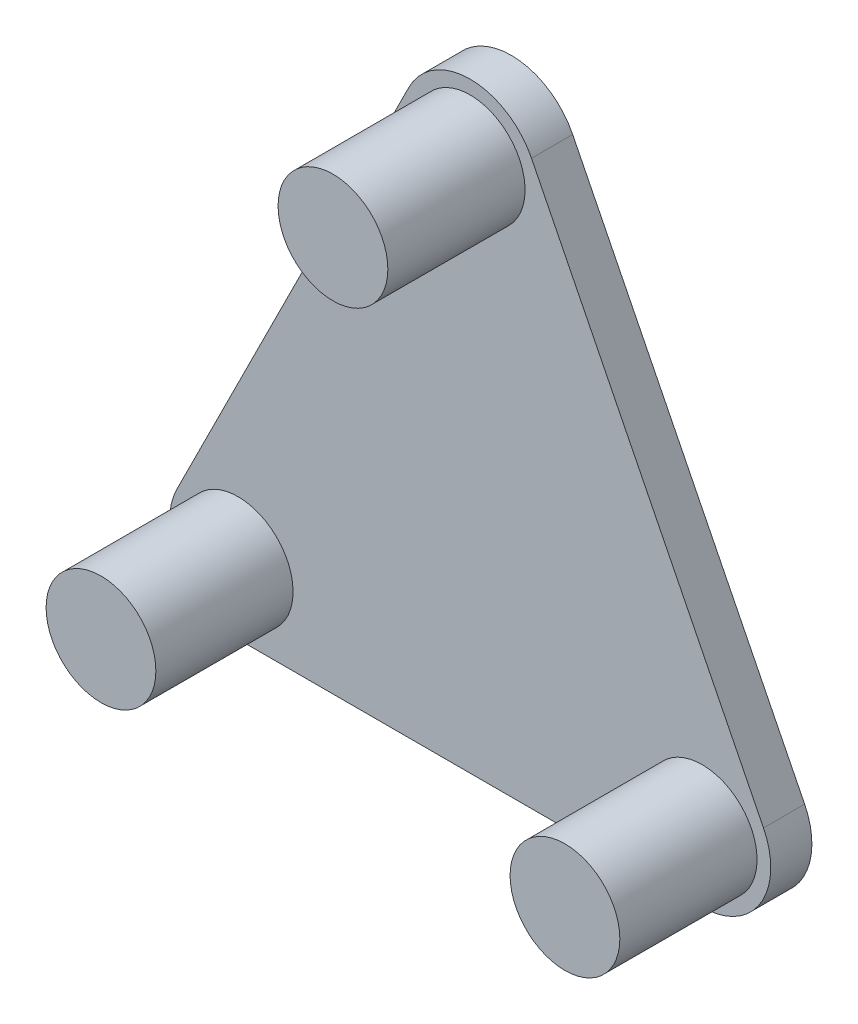
ISO-10303-21;
HEADER;
FILE_DESCRIPTION(('STEP AP214'),'2;1');
FILE_NAME('part.step','',(''),(''),'','','');
FILE_SCHEMA(('AUTOMOTIVE_DESIGN { 1 0 10303 214 1 1 1 1 }'));
ENDSEC;
DATA;
#1=APPLICATION_CONTEXT('core data for automotive mechanical design processes');
#2=APPLICATION_PROTOCOL_DEFINITION('international standard','automotive_design',2000,#1);
#3=PRODUCT_CONTEXT('',#1,'mechanical');
#4=PRODUCT('Part','Part','',(#3));
#5=PRODUCT_RELATED_PRODUCT_CATEGORY('part','',(#4));
#6=PRODUCT_DEFINITION_FORMATION('','',#4);
#7=PRODUCT_DEFINITION_CONTEXT('part definition',#1,'design');
#8=PRODUCT_DEFINITION('design','',#6,#7);
#9=PRODUCT_DEFINITION_SHAPE('','',#8);
#10=(LENGTH_UNIT() NAMED_UNIT(*) SI_UNIT(.MILLI.,.METRE.));
#11=(NAMED_UNIT(*) PLANE_ANGLE_UNIT() SI_UNIT($,.RADIAN.));
#12=(NAMED_UNIT(*) SI_UNIT($,.STERADIAN.) SOLID_ANGLE_UNIT());
#13=UNCERTAINTY_MEASURE_WITH_UNIT(LENGTH_MEASURE(1.E-05),#10,'distance_accuracy_value','');
#14=(GEOMETRIC_REPRESENTATION_CONTEXT(3) GLOBAL_UNCERTAINTY_ASSIGNED_CONTEXT((#13)) GLOBAL_UNIT_ASSIGNED_CONTEXT((#10,
#11,#12)) REPRESENTATION_CONTEXT('',''));
#15=CARTESIAN_POINT('',(0.,0.,0.));
#16=DIRECTION('',(0.,0.,1.));
#17=DIRECTION('',(1.,0.,0.));
#18=AXIS2_PLACEMENT_3D('',#15,#16,#17);
#19=CARTESIAN_POINT('',(-27.2729095431239,-12.1351891491668,3.));
#20=DIRECTION('',(0.,0.,-1.));
#21=DIRECTION('',(-1.,0.,0.));
#22=AXIS2_PLACEMENT_3D('',#19,#20,#21);
#23=CYLINDRICAL_SURFACE('',#22,4.99999999999999);
#24=CARTESIAN_POINT('',(-27.2729095431239,-12.1351891491668,0.));
#25=DIRECTION('',(0.,0.,1.));
#26=DIRECTION('',(-1.,0.,0.));
#27=AXIS2_PLACEMENT_3D('',#24,#25,#26);
#28=CIRCLE('',#27,4.99999999999999);
#29=CARTESIAN_POINT('',(-31.7450454981235,-9.89912117166701,0.));
#30=VERTEX_POINT('',#29);
#31=CARTESIAN_POINT('',(-27.2729095431239,-17.1351891491668,0.));
#32=VERTEX_POINT('',#31);
#33=EDGE_CURVE('E118',#30,#32,#28,.T.);
#34=ORIENTED_EDGE('',*,*,#33,.T.);
#35=DIRECTION('',(0.,0.,-1.));
#36=VECTOR('',#35,1.);
#37=CARTESIAN_POINT('',(-27.2729095431239,-17.1351891491668,3.));
#38=LINE('',#37,#36);
#39=CARTESIAN_POINT('',(-27.2729095431239,-17.1351891491668,3.));
#40=VERTEX_POINT('',#39);
#41=EDGE_CURVE('E136',#40,#32,#38,.T.);
#42=ORIENTED_EDGE('',*,*,#41,.F.);
#43=CARTESIAN_POINT('',(-27.2729095431239,-12.1351891491668,3.));
#44=DIRECTION('',(0.,0.,1.));
#45=DIRECTION('',(-1.,0.,0.));
#46=AXIS2_PLACEMENT_3D('',#43,#44,#45);
#47=CIRCLE('',#46,4.99999999999999);
#48=CARTESIAN_POINT('',(-31.7450454981235,-9.89912117166701,3.));
#49=VERTEX_POINT('',#48);
#50=EDGE_CURVE('E129',#49,#40,#47,.T.);
#51=ORIENTED_EDGE('',*,*,#50,.F.);
#52=DIRECTION('',(0.,0.,-1.));
#53=VECTOR('',#52,1.);
#54=CARTESIAN_POINT('',(-31.7450454981235,-9.89912117166701,3.));
#55=LINE('',#54,#53);
#56=EDGE_CURVE('E114',#49,#30,#55,.T.);
#57=ORIENTED_EDGE('',*,*,#56,.T.);
#58=EDGE_LOOP('',(#34,#42,#51,#57));
#59=FACE_BOUND('',#58,.T.);
#60=ADVANCED_FACE('F33',(#59),#23,.T.);
#61=CARTESIAN_POINT('',(-27.2729095431239,-17.1351891491668,3.));
#62=DIRECTION('',(0.,1.,0.));
#63=DIRECTION('',(-1.,0.,0.));
#64=AXIS2_PLACEMENT_3D('',#61,#62,#63);
#65=PLANE('',#64);
#66=DIRECTION('',(1.,0.,0.));
#67=VECTOR('',#66,1.);
#68=CARTESIAN_POINT('',(-27.2729095431239,-17.1351891491668,0.));
#69=LINE('',#68,#67);
#70=CARTESIAN_POINT('',(6.54675056937718,-17.1351891491668,0.));
#71=VERTEX_POINT('',#70);
#72=EDGE_CURVE('E121',#32,#71,#69,.T.);
#73=ORIENTED_EDGE('',*,*,#72,.T.);
#74=DIRECTION('',(0.,0.,-1.));
#75=VECTOR('',#74,1.);
#76=CARTESIAN_POINT('',(6.54675056937718,-17.1351891491668,3.));
#77=LINE('',#76,#75);
#78=CARTESIAN_POINT('',(6.54675056937718,-17.1351891491668,3.));
#79=VERTEX_POINT('',#78);
#80=EDGE_CURVE('E133',#79,#71,#77,.T.);
#81=ORIENTED_EDGE('',*,*,#80,.F.);
#82=DIRECTION('',(1.,0.,0.));
#83=VECTOR('',#82,1.);
#84=CARTESIAN_POINT('',(-27.2729095431239,-17.1351891491668,3.));
#85=LINE('',#84,#83);
#86=EDGE_CURVE('E87',#40,#79,#85,.T.);
#87=ORIENTED_EDGE('',*,*,#86,.F.);
#88=ORIENTED_EDGE('',*,*,#41,.T.);
#89=EDGE_LOOP('',(#73,#81,#87,#88));
#90=FACE_BOUND('',#89,.T.);
#91=ADVANCED_FACE('F168',(#90),#65,.F.);
#92=CARTESIAN_POINT('',(6.54675056937718,-12.1351891491668,3.));
#93=DIRECTION('',(0.,0.,-1.));
#94=DIRECTION('',(-1.,0.,0.));
#95=AXIS2_PLACEMENT_3D('',#92,#93,#94);
#96=CYLINDRICAL_SURFACE('',#95,4.99999999999999);
#97=CARTESIAN_POINT('',(6.54675056937718,-12.1351891491668,0.));
#98=DIRECTION('',(0.,0.,1.));
#99=DIRECTION('',(1.,0.,0.));
#100=AXIS2_PLACEMENT_3D('',#97,#98,#99);
#101=CIRCLE('',#100,4.99999999999999);
#102=CARTESIAN_POINT('',(11.0188865243768,-9.89912117166701,0.));
#103=VERTEX_POINT('',#102);
#104=EDGE_CURVE('E124',#71,#103,#101,.T.);
#105=ORIENTED_EDGE('',*,*,#104,.T.);
#106=DIRECTION('',(0.,0.,-1.));
#107=VECTOR('',#106,1.);
#108=CARTESIAN_POINT('',(11.0188865243768,-9.89912117166701,3.));
#109=LINE('',#108,#107);
#110=CARTESIAN_POINT('',(11.0188865243768,-9.89912117166701,3.));
#111=VERTEX_POINT('',#110);
#112=EDGE_CURVE('E109',#111,#103,#109,.T.);
#113=ORIENTED_EDGE('',*,*,#112,.F.);
#114=CARTESIAN_POINT('',(6.54675056937718,-12.1351891491668,3.));
#115=DIRECTION('',(0.,0.,1.));
#116=DIRECTION('',(1.,0.,0.));
#117=AXIS2_PLACEMENT_3D('',#114,#115,#116);
#118=CIRCLE('',#117,4.99999999999999);
#119=EDGE_CURVE('E100',#79,#111,#118,.T.);
#120=ORIENTED_EDGE('',*,*,#119,.F.);
#121=ORIENTED_EDGE('',*,*,#80,.T.);
#122=EDGE_LOOP('',(#105,#113,#120,#121));
#123=FACE_BOUND('',#122,.T.);
#124=ADVANCED_FACE('F173',(#123),#96,.T.);
#125=CARTESIAN_POINT('',(-5.89094353187376,23.9205389408341,3.));
#126=DIRECTION('',(-0.894427190999916,-0.447213595499958,0.));
#127=DIRECTION('',(0.447213595499958,-0.894427190999916,0.));
#128=AXIS2_PLACEMENT_3D('',#125,#126,#127);
#129=PLANE('',#128);
#130=DIRECTION('',(-0.447213595499958,0.894427190999916,0.));
#131=VECTOR('',#130,1.);
#132=CARTESIAN_POINT('',(-5.89094353187376,23.9205389408341,0.));
#133=LINE('',#132,#131);
#134=CARTESIAN_POINT('',(-5.89094353187376,23.9205389408341,0.));
#135=VERTEX_POINT('',#134);
#136=EDGE_CURVE('E108',#103,#135,#133,.T.);
#137=ORIENTED_EDGE('',*,*,#136,.T.);
#138=DIRECTION('',(0.,0.,-1.));
#139=VECTOR('',#138,1.);
#140=CARTESIAN_POINT('',(-5.89094353187376,23.9205389408341,3.));
#141=LINE('',#140,#139);
#142=CARTESIAN_POINT('',(-5.89094353187376,23.9205389408341,3.));
#143=VERTEX_POINT('',#142);
#144=EDGE_CURVE('E105',#143,#135,#141,.T.);
#145=ORIENTED_EDGE('',*,*,#144,.F.);
#146=DIRECTION('',(-0.447213595499958,0.894427190999916,0.));
#147=VECTOR('',#146,1.);
#148=CARTESIAN_POINT('',(-5.89094353187376,23.9205389408341,3.));
#149=LINE('',#148,#147);
#150=EDGE_CURVE('E94',#111,#143,#149,.T.);
#151=ORIENTED_EDGE('',*,*,#150,.F.);
#152=ORIENTED_EDGE('',*,*,#112,.T.);
#153=EDGE_LOOP('',(#137,#145,#151,#152));
#154=FACE_BOUND('',#153,.T.);
#155=ADVANCED_FACE('F106',(#154),#129,.F.);
#156=CARTESIAN_POINT('',(-10.3630794868734,21.6844709633343,3.));
#157=DIRECTION('',(0.,0.,-1.));
#158=DIRECTION('',(-1.,0.,0.));
#159=AXIS2_PLACEMENT_3D('',#156,#157,#158);
#160=CYLINDRICAL_SURFACE('',#159,5.00000000000001);
#161=CARTESIAN_POINT('',(-10.3630794868734,21.6844709633343,0.));
#162=DIRECTION('',(0.,0.,1.));
#163=DIRECTION('',(-1.,0.,0.));
#164=AXIS2_PLACEMENT_3D('',#161,#162,#163);
#165=CIRCLE('',#164,5.00000000000001);
#166=CARTESIAN_POINT('',(-14.8352154418729,23.9205389408341,0.));
#167=VERTEX_POINT('',#166);
#168=EDGE_CURVE('E72',#135,#167,#165,.T.);
#169=ORIENTED_EDGE('',*,*,#168,.T.);
#170=DIRECTION('',(0.,0.,-1.));
#171=VECTOR('',#170,1.);
#172=CARTESIAN_POINT('',(-14.8352154418729,23.9205389408341,3.));
#173=LINE('',#172,#171);
#174=CARTESIAN_POINT('',(-14.8352154418729,23.9205389408341,3.));
#175=VERTEX_POINT('',#174);
#176=EDGE_CURVE('E110',#175,#167,#173,.T.);
#177=ORIENTED_EDGE('',*,*,#176,.F.);
#178=CARTESIAN_POINT('',(-10.3630794868734,21.6844709633343,3.));
#179=DIRECTION('',(0.,0.,1.));
#180=DIRECTION('',(-1.,0.,0.));
#181=AXIS2_PLACEMENT_3D('',#178,#179,#180);
#182=CIRCLE('',#181,5.00000000000001);
#183=EDGE_CURVE('E98',#143,#175,#182,.T.);
#184=ORIENTED_EDGE('',*,*,#183,.F.);
#185=ORIENTED_EDGE('',*,*,#144,.T.);
#186=EDGE_LOOP('',(#169,#177,#184,#185));
#187=FACE_BOUND('',#186,.T.);
#188=ADVANCED_FACE('F112',(#187),#160,.T.);
#189=CARTESIAN_POINT('',(-31.7450454981235,-9.89912117166701,3.));
#190=DIRECTION('',(0.894427190999916,-0.447213595499957,0.));
#191=DIRECTION('',(0.447213595499957,0.894427190999916,0.));
#192=AXIS2_PLACEMENT_3D('',#189,#190,#191);
#193=PLANE('',#192);
#194=DIRECTION('',(-0.447213595499957,-0.894427190999916,0.));
#195=VECTOR('',#194,1.);
#196=CARTESIAN_POINT('',(-31.7450454981235,-9.89912117166701,0.));
#197=LINE('',#196,#195);
#198=EDGE_CURVE('E78',#167,#30,#197,.T.);
#199=ORIENTED_EDGE('',*,*,#198,.T.);
#200=ORIENTED_EDGE('',*,*,#56,.F.);
#201=DIRECTION('',(-0.447213595499957,-0.894427190999916,0.));
#202=VECTOR('',#201,1.);
#203=CARTESIAN_POINT('',(-31.7450454981235,-9.89912117166701,3.));
#204=LINE('',#203,#202);
#205=EDGE_CURVE('E49',#175,#49,#204,.T.);
#206=ORIENTED_EDGE('',*,*,#205,.F.);
#207=ORIENTED_EDGE('',*,*,#176,.T.);
#208=EDGE_LOOP('',(#199,#200,#206,#207));
#209=FACE_BOUND('',#208,.T.);
#210=ADVANCED_FACE('F148',(#209),#193,.F.);
#211=CARTESIAN_POINT('',(-27.2729095431239,-12.1351891491668,3.));
#212=DIRECTION('',(0.,0.,-1.));
#213=DIRECTION('',(-1.,0.,0.));
#214=AXIS2_PLACEMENT_3D('',#211,#212,#213);
#215=PLANE('',#214);
#216=CARTESIAN_POINT('',(-10.3630794868734,21.6844709633343,3.));
#217=DIRECTION('',(0.,0.,-1.));
#218=DIRECTION('',(-1.,0.,0.));
#219=AXIS2_PLACEMENT_3D('',#216,#217,#218);
#220=CIRCLE('',#219,4.);
#221=CARTESIAN_POINT('',(-14.3630794868734,21.6844709633343,3.));
#222=VERTEX_POINT('',#221);
#223=EDGE_CURVE('E11',#222,#222,#220,.F.);
#224=ORIENTED_EDGE('',*,*,#223,.F.);
#225=EDGE_LOOP('',(#224));
#226=FACE_BOUND('',#225,.T.);
#227=CARTESIAN_POINT('',(6.54675056937718,-12.1351891491668,3.));
#228=DIRECTION('',(0.,0.,-1.));
#229=DIRECTION('',(-1.,0.,0.));
#230=AXIS2_PLACEMENT_3D('',#227,#228,#229);
#231=CIRCLE('',#230,4.);
#232=CARTESIAN_POINT('',(2.54675056937718,-12.1351891491668,3.));
#233=VERTEX_POINT('',#232);
#234=EDGE_CURVE('E41',#233,#233,#231,.F.);
#235=ORIENTED_EDGE('',*,*,#234,.F.);
#236=EDGE_LOOP('',(#235));
#237=FACE_BOUND('',#236,.T.);
#238=CARTESIAN_POINT('',(-27.2729095431239,-12.1351891491668,3.));
#239=DIRECTION('',(0.,0.,-1.));
#240=DIRECTION('',(-1.,0.,0.));
#241=AXIS2_PLACEMENT_3D('',#238,#239,#240);
#242=CIRCLE('',#241,4.);
#243=CARTESIAN_POINT('',(-31.2729095431239,-12.1351891491668,3.));
#244=VERTEX_POINT('',#243);
#245=EDGE_CURVE('E138',#244,#244,#242,.F.);
#246=ORIENTED_EDGE('',*,*,#245,.F.);
#247=EDGE_LOOP('',(#246));
#248=FACE_BOUND('',#247,.T.);
#249=ORIENTED_EDGE('',*,*,#50,.T.);
#250=ORIENTED_EDGE('',*,*,#86,.T.);
#251=ORIENTED_EDGE('',*,*,#119,.T.);
#252=ORIENTED_EDGE('',*,*,#150,.T.);
#253=ORIENTED_EDGE('',*,*,#183,.T.);
#254=ORIENTED_EDGE('',*,*,#205,.T.);
#255=EDGE_LOOP('',(#249,#250,#251,#252,#253,#254));
#256=FACE_BOUND('',#255,.T.);
#257=ADVANCED_FACE('F96',(#226,#237,#248,#256),#215,.F.);
#258=CARTESIAN_POINT('',(-27.2729095431239,-12.1351891491668,0.));
#259=DIRECTION('',(0.,0.,-1.));
#260=DIRECTION('',(-1.,0.,0.));
#261=AXIS2_PLACEMENT_3D('',#258,#259,#260);
#262=PLANE('',#261);
#263=ORIENTED_EDGE('',*,*,#33,.F.);
#264=ORIENTED_EDGE('',*,*,#198,.F.);
#265=ORIENTED_EDGE('',*,*,#168,.F.);
#266=ORIENTED_EDGE('',*,*,#136,.F.);
#267=ORIENTED_EDGE('',*,*,#104,.F.);
#268=ORIENTED_EDGE('',*,*,#72,.F.);
#269=EDGE_LOOP('',(#263,#264,#265,#266,#267,#268));
#270=FACE_BOUND('',#269,.T.);
#271=ADVANCED_FACE('F147',(#270),#262,.T.);
#272=CARTESIAN_POINT('',(-27.2729095431239,-12.1351891491668,13.));
#273=DIRECTION('',(0.,0.,-1.));
#274=DIRECTION('',(-1.,0.,0.));
#275=AXIS2_PLACEMENT_3D('',#272,#273,#274);
#276=CYLINDRICAL_SURFACE('',#275,4.);
#277=CARTESIAN_POINT('',(-27.2729095431239,-12.1351891491668,13.));
#278=DIRECTION('',(0.,0.,1.));
#279=DIRECTION('',(1.,0.,0.));
#280=AXIS2_PLACEMENT_3D('',#277,#278,#279);
#281=CIRCLE('',#280,4.);
#282=CARTESIAN_POINT('',(-23.2729095431239,-12.1351891491668,13.));
#283=VERTEX_POINT('',#282);
#284=EDGE_CURVE('E122',#283,#283,#281,.T.);
#285=ORIENTED_EDGE('',*,*,#284,.F.);
#286=EDGE_LOOP('',(#285));
#287=FACE_BOUND('',#286,.T.);
#288=ORIENTED_EDGE('',*,*,#245,.T.);
#289=EDGE_LOOP('',(#288));
#290=FACE_BOUND('',#289,.T.);
#291=ADVANCED_FACE('F153',(#287,#290),#276,.T.);
#292=CARTESIAN_POINT('',(-27.2729095431239,-12.1351891491668,13.));
#293=DIRECTION('',(0.,0.,1.));
#294=DIRECTION('',(1.,0.,0.));
#295=AXIS2_PLACEMENT_3D('',#292,#293,#294);
#296=PLANE('',#295);
#297=ORIENTED_EDGE('',*,*,#284,.T.);
#298=EDGE_LOOP('',(#297));
#299=FACE_BOUND('',#298,.T.);
#300=ADVANCED_FACE('F155',(#299),#296,.T.);
#301=CARTESIAN_POINT('',(6.54675056937718,-12.1351891491668,13.));
#302=DIRECTION('',(0.,0.,-1.));
#303=DIRECTION('',(-1.,0.,0.));
#304=AXIS2_PLACEMENT_3D('',#301,#302,#303);
#305=CYLINDRICAL_SURFACE('',#304,4.);
#306=CARTESIAN_POINT('',(6.54675056937718,-12.1351891491668,13.));
#307=DIRECTION('',(0.,0.,1.));
#308=DIRECTION('',(1.,0.,0.));
#309=AXIS2_PLACEMENT_3D('',#306,#307,#308);
#310=CIRCLE('',#309,4.);
#311=CARTESIAN_POINT('',(10.5467505693772,-12.1351891491668,13.));
#312=VERTEX_POINT('',#311);
#313=EDGE_CURVE('E184',#312,#312,#310,.T.);
#314=ORIENTED_EDGE('',*,*,#313,.F.);
#315=EDGE_LOOP('',(#314));
#316=FACE_BOUND('',#315,.T.);
#317=ORIENTED_EDGE('',*,*,#234,.T.);
#318=EDGE_LOOP('',(#317));
#319=FACE_BOUND('',#318,.T.);
#320=ADVANCED_FACE('F143',(#316,#319),#305,.T.);
#321=CARTESIAN_POINT('',(6.54675056937718,-12.1351891491668,13.));
#322=DIRECTION('',(0.,0.,1.));
#323=DIRECTION('',(1.,0.,0.));
#324=AXIS2_PLACEMENT_3D('',#321,#322,#323);
#325=PLANE('',#324);
#326=ORIENTED_EDGE('',*,*,#313,.T.);
#327=EDGE_LOOP('',(#326));
#328=FACE_BOUND('',#327,.T.);
#329=ADVANCED_FACE('F196',(#328),#325,.T.);
#330=CARTESIAN_POINT('',(-10.3630794868734,21.6844709633343,13.));
#331=DIRECTION('',(0.,0.,-1.));
#332=DIRECTION('',(-1.,0.,0.));
#333=AXIS2_PLACEMENT_3D('',#330,#331,#332);
#334=CYLINDRICAL_SURFACE('',#333,4.);
#335=CARTESIAN_POINT('',(-10.3630794868734,21.6844709633343,13.));
#336=DIRECTION('',(0.,0.,1.));
#337=DIRECTION('',(1.,0.,0.));
#338=AXIS2_PLACEMENT_3D('',#335,#336,#337);
#339=CIRCLE('',#338,4.);
#340=CARTESIAN_POINT('',(-6.36307948687335,21.6844709633343,13.));
#341=VERTEX_POINT('',#340);
#342=EDGE_CURVE('E187',#341,#341,#339,.T.);
#343=ORIENTED_EDGE('',*,*,#342,.F.);
#344=EDGE_LOOP('',(#343));
#345=FACE_BOUND('',#344,.T.);
#346=ORIENTED_EDGE('',*,*,#223,.T.);
#347=EDGE_LOOP('',(#346));
#348=FACE_BOUND('',#347,.T.);
#349=ADVANCED_FACE('F193',(#345,#348),#334,.T.);
#350=CARTESIAN_POINT('',(-10.3630794868734,21.6844709633343,13.));
#351=DIRECTION('',(0.,0.,1.));
#352=DIRECTION('',(1.,0.,0.));
#353=AXIS2_PLACEMENT_3D('',#350,#351,#352);
#354=PLANE('',#353);
#355=ORIENTED_EDGE('',*,*,#342,.T.);
#356=EDGE_LOOP('',(#355));
#357=FACE_BOUND('',#356,.T.);
#358=ADVANCED_FACE('F191',(#357),#354,.T.);
#359=CLOSED_SHELL('',(#60,#91,#124,#155,#188,#210,#257,#271,#291,#300,#320,#329,#349,#358));
#360=MANIFOLD_SOLID_BREP('B2',#359);
#361=ADVANCED_BREP_SHAPE_REPRESENTATION('',(#18,#360),#14);
#362=SHAPE_DEFINITION_REPRESENTATION(#9,#361);
ENDSEC;
END-ISO-10303-21;
